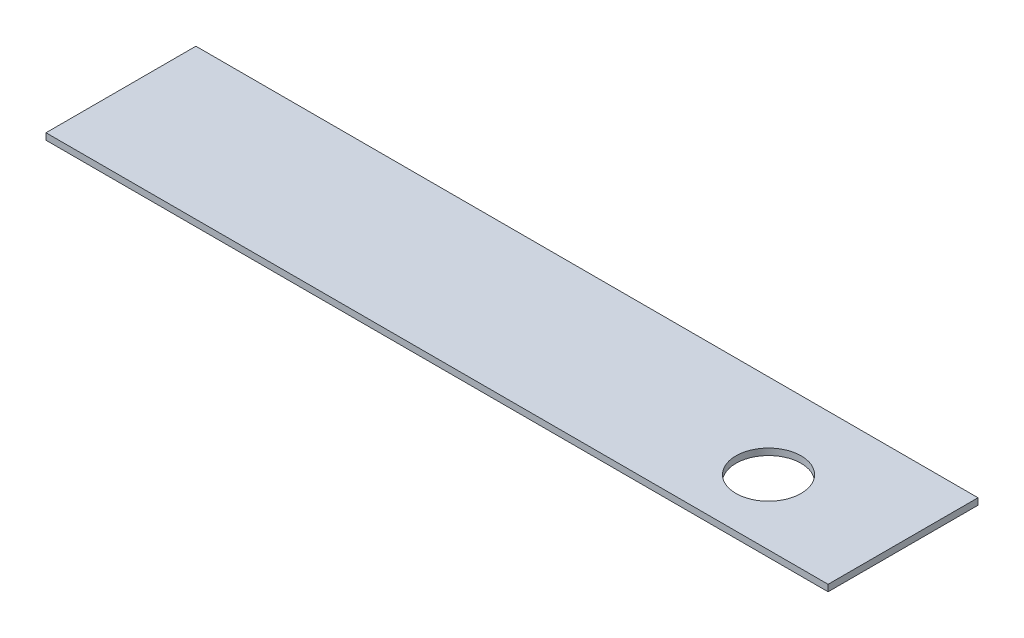
ISO-10303-21;
HEADER;
FILE_DESCRIPTION(('STEP AP214'),'2;1');
FILE_NAME('part.step','',(''),(''),'','','');
FILE_SCHEMA(('AUTOMOTIVE_DESIGN { 1 0 10303 214 1 1 1 1 }'));
ENDSEC;
DATA;
#1=APPLICATION_CONTEXT('core data for automotive mechanical design processes');
#2=APPLICATION_PROTOCOL_DEFINITION('international standard','automotive_design',2000,#1);
#3=PRODUCT_CONTEXT('',#1,'mechanical');
#4=PRODUCT('Part','Part','',(#3));
#5=PRODUCT_RELATED_PRODUCT_CATEGORY('part','',(#4));
#6=PRODUCT_DEFINITION_FORMATION('','',#4);
#7=PRODUCT_DEFINITION_CONTEXT('part definition',#1,'design');
#8=PRODUCT_DEFINITION('design','',#6,#7);
#9=PRODUCT_DEFINITION_SHAPE('','',#8);
#10=(LENGTH_UNIT() NAMED_UNIT(*) SI_UNIT(.MILLI.,.METRE.));
#11=(NAMED_UNIT(*) PLANE_ANGLE_UNIT() SI_UNIT($,.RADIAN.));
#12=(NAMED_UNIT(*) SI_UNIT($,.STERADIAN.) SOLID_ANGLE_UNIT());
#13=UNCERTAINTY_MEASURE_WITH_UNIT(LENGTH_MEASURE(1.E-05),#10,'distance_accuracy_value','');
#14=(GEOMETRIC_REPRESENTATION_CONTEXT(3) GLOBAL_UNCERTAINTY_ASSIGNED_CONTEXT((#13)) GLOBAL_UNIT_ASSIGNED_CONTEXT((#10,
#11,#12)) REPRESENTATION_CONTEXT('',''));
#15=CARTESIAN_POINT('',(0.,0.,0.));
#16=DIRECTION('',(0.,0.,1.));
#17=DIRECTION('',(1.,0.,0.));
#18=AXIS2_PLACEMENT_3D('',#15,#16,#17);
#19=CARTESIAN_POINT('',(299.490005302849,-216.429379744161,286.008333188662));
#20=DIRECTION('',(-1.,0.,0.));
#21=DIRECTION('',(0.,0.,1.));
#22=AXIS2_PLACEMENT_3D('',#19,#20,#21);
#23=PLANE('',#22);
#24=DIRECTION('',(0.,1.,0.));
#25=VECTOR('',#24,1.);
#26=CARTESIAN_POINT('',(299.490005302849,-216.429379744161,46.));
#27=LINE('',#26,#25);
#28=CARTESIAN_POINT('',(299.490005302849,-218.429379744161,46.));
#29=VERTEX_POINT('',#28);
#30=CARTESIAN_POINT('',(299.490005302849,-216.429379744161,46.));
#31=VERTEX_POINT('',#30);
#32=EDGE_CURVE('E83',#29,#31,#27,.T.);
#33=ORIENTED_EDGE('',*,*,#32,.F.);
#34=DIRECTION('',(0.,0.,-1.));
#35=VECTOR('',#34,1.);
#36=CARTESIAN_POINT('',(299.490005302849,-218.429379744161,286.008333188662));
#37=LINE('',#36,#35);
#38=CARTESIAN_POINT('',(299.490005302849,-218.429379744161,0.));
#39=VERTEX_POINT('',#38);
#40=EDGE_CURVE('E37',#29,#39,#37,.T.);
#41=ORIENTED_EDGE('',*,*,#40,.T.);
#42=DIRECTION('',(0.,1.,0.));
#43=VECTOR('',#42,1.);
#44=CARTESIAN_POINT('',(299.490005302849,-216.429379744161,0.));
#45=LINE('',#44,#43);
#46=CARTESIAN_POINT('',(299.490005302849,-216.429379744161,0.));
#47=VERTEX_POINT('',#46);
#48=EDGE_CURVE('E81',#39,#47,#45,.T.);
#49=ORIENTED_EDGE('',*,*,#48,.T.);
#50=DIRECTION('',(0.,0.,-1.));
#51=VECTOR('',#50,1.);
#52=CARTESIAN_POINT('',(299.490005302849,-216.429379744161,286.008333188662));
#53=LINE('',#52,#51);
#54=EDGE_CURVE('E72',#31,#47,#53,.T.);
#55=ORIENTED_EDGE('',*,*,#54,.F.);
#56=EDGE_LOOP('',(#33,#41,#49,#55));
#57=FACE_BOUND('',#56,.T.);
#58=ADVANCED_FACE('F33',(#57),#23,.F.);
#59=CARTESIAN_POINT('',(299.490005302849,-216.429379744161,286.008333188662));
#60=DIRECTION('',(0.,-1.,0.));
#61=DIRECTION('',(1.,0.,0.));
#62=AXIS2_PLACEMENT_3D('',#59,#60,#61);
#63=PLANE('',#62);
#64=CARTESIAN_POINT('',(261.207431355523,-216.429379744161,26.));
#65=DIRECTION('',(0.,1.,0.));
#66=DIRECTION('',(-1.,0.,0.));
#67=AXIS2_PLACEMENT_3D('',#64,#65,#66);
#68=CIRCLE('',#67,9.99999999999998);
#69=CARTESIAN_POINT('',(251.207431355523,-216.429379744161,26.));
#70=VERTEX_POINT('',#69);
#71=EDGE_CURVE('E109',#70,#70,#68,.T.);
#72=ORIENTED_EDGE('',*,*,#71,.F.);
#73=EDGE_LOOP('',(#72));
#74=FACE_BOUND('',#73,.T.);
#75=DIRECTION('',(-1.,0.,0.));
#76=VECTOR('',#75,1.);
#77=CARTESIAN_POINT('',(299.490005302849,-216.429379744161,46.));
#78=LINE('',#77,#76);
#79=CARTESIAN_POINT('',(59.490005302849,-216.429379744161,46.));
#80=VERTEX_POINT('',#79);
#81=EDGE_CURVE('E42',#31,#80,#78,.T.);
#82=ORIENTED_EDGE('',*,*,#81,.F.);
#83=ORIENTED_EDGE('',*,*,#54,.T.);
#84=DIRECTION('',(-1.,0.,0.));
#85=VECTOR('',#84,1.);
#86=CARTESIAN_POINT('',(299.490005302849,-216.429379744161,0.));
#87=LINE('',#86,#85);
#88=CARTESIAN_POINT('',(59.490005302849,-216.429379744161,0.));
#89=VERTEX_POINT('',#88);
#90=EDGE_CURVE('E94',#47,#89,#87,.T.);
#91=ORIENTED_EDGE('',*,*,#90,.T.);
#92=DIRECTION('',(0.,0.,-1.));
#93=VECTOR('',#92,1.);
#94=CARTESIAN_POINT('',(59.490005302849,-216.429379744161,286.008333188662));
#95=LINE('',#94,#93);
#96=EDGE_CURVE('E103',#80,#89,#95,.T.);
#97=ORIENTED_EDGE('',*,*,#96,.F.);
#98=EDGE_LOOP('',(#82,#83,#91,#97));
#99=FACE_BOUND('',#98,.T.);
#100=ADVANCED_FACE('F115',(#74,#99),#63,.F.);
#101=CARTESIAN_POINT('',(59.490005302849,-216.429379744161,286.008333188662));
#102=DIRECTION('',(1.,0.,0.));
#103=DIRECTION('',(0.,0.,-1.));
#104=AXIS2_PLACEMENT_3D('',#101,#102,#103);
#105=PLANE('',#104);
#106=DIRECTION('',(0.,-1.,0.));
#107=VECTOR('',#106,1.);
#108=CARTESIAN_POINT('',(59.490005302849,-216.429379744161,46.));
#109=LINE('',#108,#107);
#110=CARTESIAN_POINT('',(59.490005302849,-218.429379744161,46.));
#111=VERTEX_POINT('',#110);
#112=EDGE_CURVE('E11',#80,#111,#109,.T.);
#113=ORIENTED_EDGE('',*,*,#112,.F.);
#114=ORIENTED_EDGE('',*,*,#96,.T.);
#115=DIRECTION('',(0.,-1.,0.));
#116=VECTOR('',#115,1.);
#117=CARTESIAN_POINT('',(59.490005302849,-216.429379744161,0.));
#118=LINE('',#117,#116);
#119=CARTESIAN_POINT('',(59.490005302849,-218.429379744161,0.));
#120=VERTEX_POINT('',#119);
#121=EDGE_CURVE('E104',#89,#120,#118,.T.);
#122=ORIENTED_EDGE('',*,*,#121,.T.);
#123=DIRECTION('',(0.,0.,-1.));
#124=VECTOR('',#123,1.);
#125=CARTESIAN_POINT('',(59.490005302849,-218.429379744161,286.008333188662));
#126=LINE('',#125,#124);
#127=EDGE_CURVE('E55',#111,#120,#126,.T.);
#128=ORIENTED_EDGE('',*,*,#127,.F.);
#129=EDGE_LOOP('',(#113,#114,#122,#128));
#130=FACE_BOUND('',#129,.T.);
#131=ADVANCED_FACE('F117',(#130),#105,.F.);
#132=CARTESIAN_POINT('',(299.490005302849,-218.429379744161,286.008333188662));
#133=DIRECTION('',(0.,1.,0.));
#134=DIRECTION('',(0.,0.,1.));
#135=AXIS2_PLACEMENT_3D('',#132,#133,#134);
#136=PLANE('',#135);
#137=CARTESIAN_POINT('',(261.207431355523,-218.429379744161,26.));
#138=DIRECTION('',(0.,1.,0.));
#139=DIRECTION('',(0.,0.,1.));
#140=AXIS2_PLACEMENT_3D('',#137,#138,#139);
#141=CIRCLE('',#140,9.99999999999998);
#142=CARTESIAN_POINT('',(261.207431355523,-218.429379744161,36.));
#143=VERTEX_POINT('',#142);
#144=EDGE_CURVE('E85',#143,#143,#141,.F.);
#145=ORIENTED_EDGE('',*,*,#144,.F.);
#146=EDGE_LOOP('',(#145));
#147=FACE_BOUND('',#146,.T.);
#148=DIRECTION('',(1.,0.,0.));
#149=VECTOR('',#148,1.);
#150=CARTESIAN_POINT('',(299.490005302849,-218.429379744161,46.));
#151=LINE('',#150,#149);
#152=EDGE_CURVE('E91',#111,#29,#151,.T.);
#153=ORIENTED_EDGE('',*,*,#152,.F.);
#154=ORIENTED_EDGE('',*,*,#127,.T.);
#155=DIRECTION('',(1.,0.,0.));
#156=VECTOR('',#155,1.);
#157=CARTESIAN_POINT('',(299.490005302849,-218.429379744161,0.));
#158=LINE('',#157,#156);
#159=EDGE_CURVE('E87',#120,#39,#158,.T.);
#160=ORIENTED_EDGE('',*,*,#159,.T.);
#161=ORIENTED_EDGE('',*,*,#40,.F.);
#162=EDGE_LOOP('',(#153,#154,#160,#161));
#163=FACE_BOUND('',#162,.T.);
#164=ADVANCED_FACE('F88',(#147,#163),#136,.F.);
#165=CARTESIAN_POINT('',(0.,0.,0.));
#166=DIRECTION('',(0.,0.,-1.));
#167=DIRECTION('',(-1.,0.,0.));
#168=AXIS2_PLACEMENT_3D('',#165,#166,#167);
#169=PLANE('',#168);
#170=ORIENTED_EDGE('',*,*,#48,.F.);
#171=ORIENTED_EDGE('',*,*,#159,.F.);
#172=ORIENTED_EDGE('',*,*,#121,.F.);
#173=ORIENTED_EDGE('',*,*,#90,.F.);
#174=EDGE_LOOP('',(#170,#171,#172,#173));
#175=FACE_BOUND('',#174,.T.);
#176=ADVANCED_FACE('F93',(#175),#169,.T.);
#177=CARTESIAN_POINT('',(127.204291017135,-267.920996218402,46.));
#178=DIRECTION('',(0.,0.,1.));
#179=DIRECTION('',(0.,-1.,0.));
#180=AXIS2_PLACEMENT_3D('',#177,#178,#179);
#181=PLANE('',#180);
#182=ORIENTED_EDGE('',*,*,#152,.T.);
#183=ORIENTED_EDGE('',*,*,#32,.T.);
#184=ORIENTED_EDGE('',*,*,#81,.T.);
#185=ORIENTED_EDGE('',*,*,#112,.T.);
#186=EDGE_LOOP('',(#182,#183,#184,#185));
#187=FACE_BOUND('',#186,.T.);
#188=ADVANCED_FACE('F35',(#187),#181,.T.);
#189=CARTESIAN_POINT('',(261.207431355523,-246.713650991622,26.));
#190=DIRECTION('',(0.,1.,0.));
#191=DIRECTION('',(-1.,0.,0.));
#192=AXIS2_PLACEMENT_3D('',#189,#190,#191);
#193=CYLINDRICAL_SURFACE('',#192,9.99999999999998);
#194=ORIENTED_EDGE('',*,*,#144,.T.);
#195=EDGE_LOOP('',(#194));
#196=FACE_BOUND('',#195,.T.);
#197=ORIENTED_EDGE('',*,*,#71,.T.);
#198=EDGE_LOOP('',(#197));
#199=FACE_BOUND('',#198,.T.);
#200=ADVANCED_FACE('F113',(#196,#199),#193,.F.);
#201=CLOSED_SHELL('',(#58,#100,#131,#164,#176,#188,#200));
#202=MANIFOLD_SOLID_BREP('B2',#201);
#203=ADVANCED_BREP_SHAPE_REPRESENTATION('',(#18,#202),#14);
#204=SHAPE_DEFINITION_REPRESENTATION(#9,#203);
ENDSEC;
END-ISO-10303-21;
